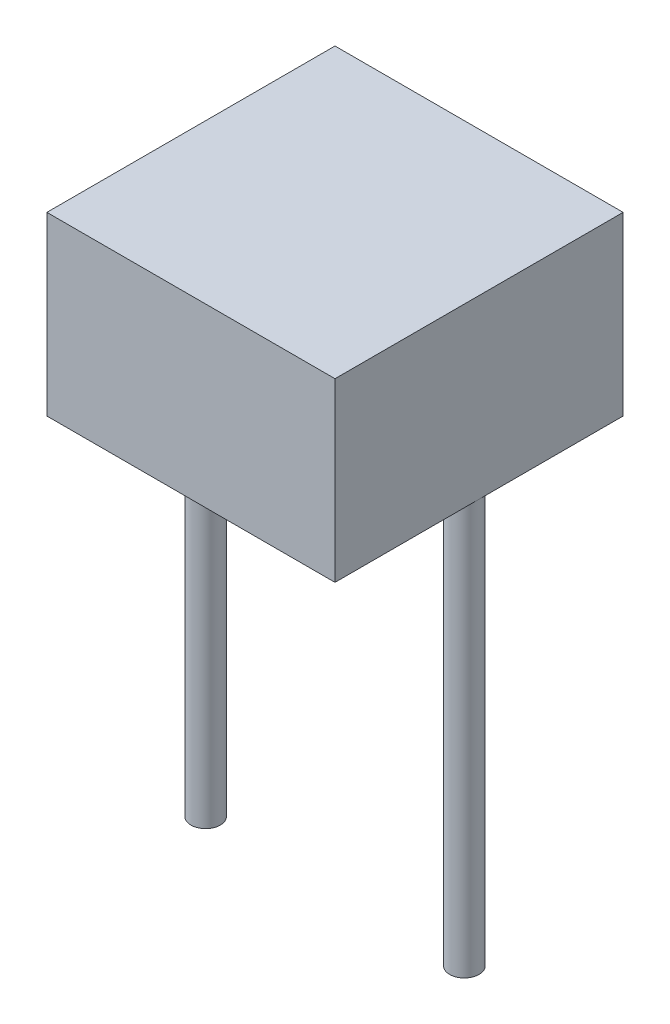
ISO-10303-21;
HEADER;
FILE_DESCRIPTION(('STEP AP214'),'2;1');
FILE_NAME('part.step','',(''),(''),'','','');
FILE_SCHEMA(('AUTOMOTIVE_DESIGN { 1 0 10303 214 1 1 1 1 }'));
ENDSEC;
DATA;
#1=APPLICATION_CONTEXT('core data for automotive mechanical design processes');
#2=APPLICATION_PROTOCOL_DEFINITION('international standard','automotive_design',2000,#1);
#3=PRODUCT_CONTEXT('',#1,'mechanical');
#4=PRODUCT('Part','Part','',(#3));
#5=PRODUCT_RELATED_PRODUCT_CATEGORY('part','',(#4));
#6=PRODUCT_DEFINITION_FORMATION('','',#4);
#7=PRODUCT_DEFINITION_CONTEXT('part definition',#1,'design');
#8=PRODUCT_DEFINITION('design','',#6,#7);
#9=PRODUCT_DEFINITION_SHAPE('','',#8);
#10=(LENGTH_UNIT() NAMED_UNIT(*) SI_UNIT(.MILLI.,.METRE.));
#11=(NAMED_UNIT(*) PLANE_ANGLE_UNIT() SI_UNIT($,.RADIAN.));
#12=(NAMED_UNIT(*) SI_UNIT($,.STERADIAN.) SOLID_ANGLE_UNIT());
#13=UNCERTAINTY_MEASURE_WITH_UNIT(LENGTH_MEASURE(1.E-05),#10,'distance_accuracy_value','');
#14=(GEOMETRIC_REPRESENTATION_CONTEXT(3) GLOBAL_UNCERTAINTY_ASSIGNED_CONTEXT((#13)) GLOBAL_UNIT_ASSIGNED_CONTEXT((#10,
#11,#12)) REPRESENTATION_CONTEXT('',''));
#15=CARTESIAN_POINT('',(0.,0.,0.));
#16=DIRECTION('',(0.,0.,1.));
#17=DIRECTION('',(1.,0.,0.));
#18=AXIS2_PLACEMENT_3D('',#15,#16,#17);
#19=CARTESIAN_POINT('',(3.1115,3.81,-3.1115));
#20=DIRECTION('',(-1.,0.,0.));
#21=DIRECTION('',(0.,0.,1.));
#22=AXIS2_PLACEMENT_3D('',#19,#20,#21);
#23=PLANE('',#22);
#24=DIRECTION('',(0.,0.,-1.));
#25=VECTOR('',#24,1.);
#26=CARTESIAN_POINT('',(3.1115,0.,-3.1115));
#27=LINE('',#26,#25);
#28=CARTESIAN_POINT('',(3.1115,0.,3.1115));
#29=VERTEX_POINT('',#28);
#30=CARTESIAN_POINT('',(3.1115,0.,0.));
#31=VERTEX_POINT('',#30);
#32=EDGE_CURVE('E87',#29,#31,#27,.T.);
#33=ORIENTED_EDGE('',*,*,#32,.T.);
#34=CARTESIAN_POINT('',(3.1115,0.,-3.1115));
#35=VERTEX_POINT('',#34);
#36=EDGE_CURVE('E90',#31,#35,#27,.T.);
#37=ORIENTED_EDGE('',*,*,#36,.T.);
#38=DIRECTION('',(0.,-1.,0.));
#39=VECTOR('',#38,1.);
#40=CARTESIAN_POINT('',(3.1115,3.81,-3.1115));
#41=LINE('',#40,#39);
#42=CARTESIAN_POINT('',(3.1115,3.81,-3.1115));
#43=VERTEX_POINT('',#42);
#44=EDGE_CURVE('E11',#43,#35,#41,.T.);
#45=ORIENTED_EDGE('',*,*,#44,.F.);
#46=DIRECTION('',(0.,0.,-1.));
#47=VECTOR('',#46,1.);
#48=CARTESIAN_POINT('',(3.1115,3.81,-3.1115));
#49=LINE('',#48,#47);
#50=CARTESIAN_POINT('',(3.1115,3.81,3.1115));
#51=VERTEX_POINT('',#50);
#52=EDGE_CURVE('E113',#51,#43,#49,.T.);
#53=ORIENTED_EDGE('',*,*,#52,.F.);
#54=DIRECTION('',(0.,-1.,0.));
#55=VECTOR('',#54,1.);
#56=CARTESIAN_POINT('',(3.1115,3.81,3.1115));
#57=LINE('',#56,#55);
#58=EDGE_CURVE('E93',#51,#29,#57,.T.);
#59=ORIENTED_EDGE('',*,*,#58,.T.);
#60=EDGE_LOOP('',(#33,#37,#45,#53,#59));
#61=FACE_BOUND('',#60,.T.);
#62=ADVANCED_FACE('F33',(#61),#23,.F.);
#63=CARTESIAN_POINT('',(-3.1115,3.81,-3.1115));
#64=DIRECTION('',(0.,0.,1.));
#65=DIRECTION('',(1.,0.,0.));
#66=AXIS2_PLACEMENT_3D('',#63,#64,#65);
#67=PLANE('',#66);
#68=DIRECTION('',(-1.,0.,0.));
#69=VECTOR('',#68,1.);
#70=CARTESIAN_POINT('',(-3.1115,0.,-3.1115));
#71=LINE('',#70,#69);
#72=CARTESIAN_POINT('',(-3.1115,0.,-3.1115));
#73=VERTEX_POINT('',#72);
#74=EDGE_CURVE('E96',#35,#73,#71,.T.);
#75=ORIENTED_EDGE('',*,*,#74,.T.);
#76=DIRECTION('',(0.,-1.,0.));
#77=VECTOR('',#76,1.);
#78=CARTESIAN_POINT('',(-3.1115,3.81,-3.1115));
#79=LINE('',#78,#77);
#80=CARTESIAN_POINT('',(-3.1115,3.81,-3.1115));
#81=VERTEX_POINT('',#80);
#82=EDGE_CURVE('E41',#81,#73,#79,.T.);
#83=ORIENTED_EDGE('',*,*,#82,.F.);
#84=DIRECTION('',(-1.,0.,0.));
#85=VECTOR('',#84,1.);
#86=CARTESIAN_POINT('',(-3.1115,3.81,-3.1115));
#87=LINE('',#86,#85);
#88=EDGE_CURVE('E80',#43,#81,#87,.T.);
#89=ORIENTED_EDGE('',*,*,#88,.F.);
#90=ORIENTED_EDGE('',*,*,#44,.T.);
#91=EDGE_LOOP('',(#75,#83,#89,#90));
#92=FACE_BOUND('',#91,.T.);
#93=ADVANCED_FACE('F132',(#92),#67,.F.);
#94=CARTESIAN_POINT('',(-3.1115,3.81,-3.1115));
#95=DIRECTION('',(1.,0.,0.));
#96=DIRECTION('',(0.,0.,-1.));
#97=AXIS2_PLACEMENT_3D('',#94,#95,#96);
#98=PLANE('',#97);
#99=DIRECTION('',(0.,0.,1.));
#100=VECTOR('',#99,1.);
#101=CARTESIAN_POINT('',(-3.1115,0.,-3.1115));
#102=LINE('',#101,#100);
#103=CARTESIAN_POINT('',(-3.1115,0.,0.));
#104=VERTEX_POINT('',#103);
#105=EDGE_CURVE('E110',#73,#104,#102,.T.);
#106=ORIENTED_EDGE('',*,*,#105,.T.);
#107=CARTESIAN_POINT('',(-3.1115,0.,3.1115));
#108=VERTEX_POINT('',#107);
#109=EDGE_CURVE('E67',#104,#108,#102,.T.);
#110=ORIENTED_EDGE('',*,*,#109,.T.);
#111=DIRECTION('',(0.,-1.,0.));
#112=VECTOR('',#111,1.);
#113=CARTESIAN_POINT('',(-3.1115,3.81,3.1115));
#114=LINE('',#113,#112);
#115=CARTESIAN_POINT('',(-3.1115,3.81,3.1115));
#116=VERTEX_POINT('',#115);
#117=EDGE_CURVE('E115',#116,#108,#114,.T.);
#118=ORIENTED_EDGE('',*,*,#117,.F.);
#119=DIRECTION('',(0.,0.,1.));
#120=VECTOR('',#119,1.);
#121=CARTESIAN_POINT('',(-3.1115,3.81,-3.1115));
#122=LINE('',#121,#120);
#123=EDGE_CURVE('E119',#81,#116,#122,.T.);
#124=ORIENTED_EDGE('',*,*,#123,.F.);
#125=ORIENTED_EDGE('',*,*,#82,.T.);
#126=EDGE_LOOP('',(#106,#110,#118,#124,#125));
#127=FACE_BOUND('',#126,.T.);
#128=ADVANCED_FACE('F118',(#127),#98,.F.);
#129=CARTESIAN_POINT('',(-3.1115,3.81,3.1115));
#130=DIRECTION('',(0.,0.,-1.));
#131=DIRECTION('',(-1.,0.,0.));
#132=AXIS2_PLACEMENT_3D('',#129,#130,#131);
#133=PLANE('',#132);
#134=DIRECTION('',(1.,0.,0.));
#135=VECTOR('',#134,1.);
#136=CARTESIAN_POINT('',(-3.1115,0.,3.1115));
#137=LINE('',#136,#135);
#138=EDGE_CURVE('E73',#108,#29,#137,.T.);
#139=ORIENTED_EDGE('',*,*,#138,.T.);
#140=ORIENTED_EDGE('',*,*,#58,.F.);
#141=DIRECTION('',(1.,0.,0.));
#142=VECTOR('',#141,1.);
#143=CARTESIAN_POINT('',(-3.1115,3.81,3.1115));
#144=LINE('',#143,#142);
#145=EDGE_CURVE('E49',#116,#51,#144,.T.);
#146=ORIENTED_EDGE('',*,*,#145,.F.);
#147=ORIENTED_EDGE('',*,*,#117,.T.);
#148=EDGE_LOOP('',(#139,#140,#146,#147));
#149=FACE_BOUND('',#148,.T.);
#150=ADVANCED_FACE('F131',(#149),#133,.F.);
#151=CARTESIAN_POINT('',(0.,3.81,0.));
#152=DIRECTION('',(0.,1.,0.));
#153=DIRECTION('',(0.,0.,1.));
#154=AXIS2_PLACEMENT_3D('',#151,#152,#153);
#155=PLANE('',#154);
#156=ORIENTED_EDGE('',*,*,#52,.T.);
#157=ORIENTED_EDGE('',*,*,#88,.T.);
#158=ORIENTED_EDGE('',*,*,#123,.T.);
#159=ORIENTED_EDGE('',*,*,#145,.T.);
#160=EDGE_LOOP('',(#156,#157,#158,#159));
#161=FACE_BOUND('',#160,.T.);
#162=ADVANCED_FACE('F130',(#161),#155,.T.);
#163=CARTESIAN_POINT('',(0.,0.,0.));
#164=DIRECTION('',(0.,1.,0.));
#165=DIRECTION('',(0.,0.,1.));
#166=AXIS2_PLACEMENT_3D('',#163,#164,#165);
#167=PLANE('',#166);
#168=ORIENTED_EDGE('',*,*,#36,.F.);
#169=CARTESIAN_POINT('',(2.794,0.,0.));
#170=DIRECTION('',(0.,-1.,0.));
#171=DIRECTION('',(0.,0.,-1.));
#172=AXIS2_PLACEMENT_3D('',#169,#170,#171);
#173=CIRCLE('',#172,0.3175);
#174=EDGE_CURVE('E100',#31,#31,#173,.T.);
#175=ORIENTED_EDGE('',*,*,#174,.F.);
#176=ORIENTED_EDGE('',*,*,#32,.F.);
#177=ORIENTED_EDGE('',*,*,#138,.F.);
#178=ORIENTED_EDGE('',*,*,#109,.F.);
#179=CARTESIAN_POINT('',(-2.794,0.,0.));
#180=DIRECTION('',(0.,-1.,0.));
#181=DIRECTION('',(0.,0.,-1.));
#182=AXIS2_PLACEMENT_3D('',#179,#180,#181);
#183=CIRCLE('',#182,0.3175);
#184=EDGE_CURVE('E104',#104,#104,#183,.T.);
#185=ORIENTED_EDGE('',*,*,#184,.F.);
#186=ORIENTED_EDGE('',*,*,#105,.F.);
#187=ORIENTED_EDGE('',*,*,#74,.F.);
#188=EDGE_LOOP('',(#168,#175,#176,#177,#178,#185,#186,#187));
#189=FACE_BOUND('',#188,.T.);
#190=ADVANCED_FACE('F98',(#189),#167,.F.);
#191=CARTESIAN_POINT('',(-2.794,-8.89,0.));
#192=DIRECTION('',(0.,1.,0.));
#193=DIRECTION('',(0.,0.,1.));
#194=AXIS2_PLACEMENT_3D('',#191,#192,#193);
#195=CYLINDRICAL_SURFACE('',#194,0.3175);
#196=CARTESIAN_POINT('',(-2.794,-8.89,0.));
#197=DIRECTION('',(0.,-1.,0.));
#198=DIRECTION('',(0.,0.,-1.));
#199=AXIS2_PLACEMENT_3D('',#196,#197,#198);
#200=CIRCLE('',#199,0.3175);
#201=CARTESIAN_POINT('',(-2.794,-8.89,-0.3175));
#202=VERTEX_POINT('',#201);
#203=EDGE_CURVE('E102',#202,#202,#200,.T.);
#204=ORIENTED_EDGE('',*,*,#203,.F.);
#205=EDGE_LOOP('',(#204));
#206=FACE_BOUND('',#205,.T.);
#207=ORIENTED_EDGE('',*,*,#184,.T.);
#208=EDGE_LOOP('',(#207));
#209=FACE_BOUND('',#208,.T.);
#210=ADVANCED_FACE('F144',(#206,#209),#195,.T.);
#211=CARTESIAN_POINT('',(-2.794,-8.89,0.));
#212=DIRECTION('',(0.,-1.,0.));
#213=DIRECTION('',(0.,0.,-1.));
#214=AXIS2_PLACEMENT_3D('',#211,#212,#213);
#215=PLANE('',#214);
#216=ORIENTED_EDGE('',*,*,#203,.T.);
#217=EDGE_LOOP('',(#216));
#218=FACE_BOUND('',#217,.T.);
#219=ADVANCED_FACE('F149',(#218),#215,.T.);
#220=CARTESIAN_POINT('',(2.794,-8.89,0.));
#221=DIRECTION('',(0.,1.,0.));
#222=DIRECTION('',(0.,0.,1.));
#223=AXIS2_PLACEMENT_3D('',#220,#221,#222);
#224=CYLINDRICAL_SURFACE('',#223,0.3175);
#225=CARTESIAN_POINT('',(2.794,-8.89,0.));
#226=DIRECTION('',(0.,-1.,0.));
#227=DIRECTION('',(0.,0.,-1.));
#228=AXIS2_PLACEMENT_3D('',#225,#226,#227);
#229=CIRCLE('',#228,0.3175);
#230=CARTESIAN_POINT('',(2.794,-8.89,-0.3175));
#231=VERTEX_POINT('',#230);
#232=EDGE_CURVE('E123',#231,#231,#229,.T.);
#233=ORIENTED_EDGE('',*,*,#232,.F.);
#234=EDGE_LOOP('',(#233));
#235=FACE_BOUND('',#234,.T.);
#236=ORIENTED_EDGE('',*,*,#174,.T.);
#237=EDGE_LOOP('',(#236));
#238=FACE_BOUND('',#237,.T.);
#239=ADVANCED_FACE('F153',(#235,#238),#224,.T.);
#240=CARTESIAN_POINT('',(2.794,-8.89,0.));
#241=DIRECTION('',(0.,-1.,0.));
#242=DIRECTION('',(0.,0.,-1.));
#243=AXIS2_PLACEMENT_3D('',#240,#241,#242);
#244=PLANE('',#243);
#245=ORIENTED_EDGE('',*,*,#232,.T.);
#246=EDGE_LOOP('',(#245));
#247=FACE_BOUND('',#246,.T.);
#248=ADVANCED_FACE('F157',(#247),#244,.T.);
#249=CLOSED_SHELL('',(#62,#93,#128,#150,#162,#190,#210,#219,#239,#248));
#250=MANIFOLD_SOLID_BREP('B2',#249);
#251=ADVANCED_BREP_SHAPE_REPRESENTATION('',(#18,#250),#14);
#252=SHAPE_DEFINITION_REPRESENTATION(#9,#251);
ENDSEC;
END-ISO-10303-21;
